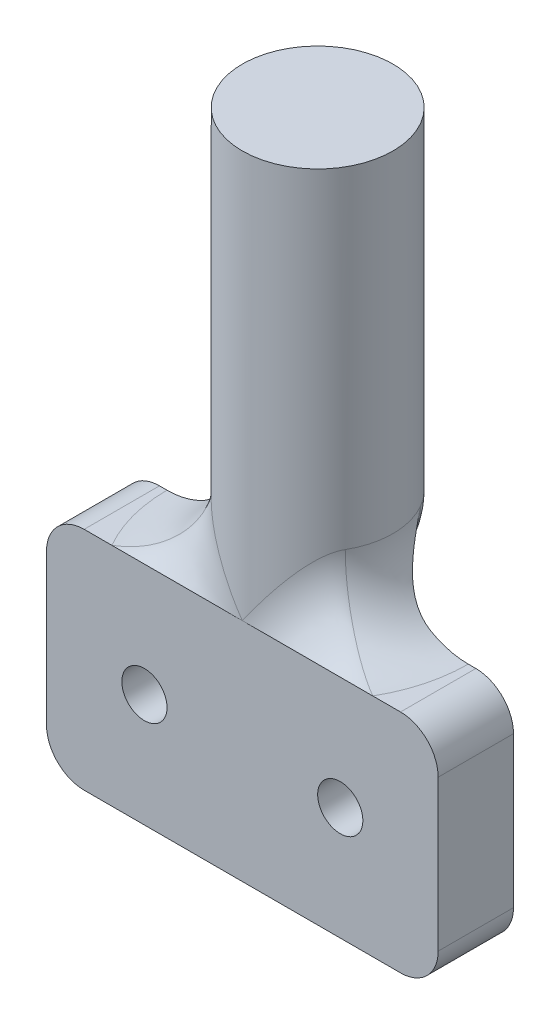
ISO-10303-21;
HEADER;
FILE_DESCRIPTION(('STEP AP214'),'2;1');
FILE_NAME('part.step','',(''),(''),'','','');
FILE_SCHEMA(('AUTOMOTIVE_DESIGN { 1 0 10303 214 1 1 1 1 }'));
ENDSEC;
DATA;
#1=APPLICATION_CONTEXT('core data for automotive mechanical design processes');
#2=APPLICATION_PROTOCOL_DEFINITION('international standard','automotive_design',2000,#1);
#3=PRODUCT_CONTEXT('',#1,'mechanical');
#4=PRODUCT('Part','Part','',(#3));
#5=PRODUCT_RELATED_PRODUCT_CATEGORY('part','',(#4));
#6=PRODUCT_DEFINITION_FORMATION('','',#4);
#7=PRODUCT_DEFINITION_CONTEXT('part definition',#1,'design');
#8=PRODUCT_DEFINITION('design','',#6,#7);
#9=PRODUCT_DEFINITION_SHAPE('','',#8);
#10=(LENGTH_UNIT() NAMED_UNIT(*) SI_UNIT(.MILLI.,.METRE.));
#11=(NAMED_UNIT(*) PLANE_ANGLE_UNIT() SI_UNIT($,.RADIAN.));
#12=(NAMED_UNIT(*) SI_UNIT($,.STERADIAN.) SOLID_ANGLE_UNIT());
#13=UNCERTAINTY_MEASURE_WITH_UNIT(LENGTH_MEASURE(1.E-05),#10,'distance_accuracy_value','');
#14=(GEOMETRIC_REPRESENTATION_CONTEXT(3) GLOBAL_UNCERTAINTY_ASSIGNED_CONTEXT((#13)) GLOBAL_UNIT_ASSIGNED_CONTEXT((#10,
#11,#12)) REPRESENTATION_CONTEXT('',''));
#15=CARTESIAN_POINT('',(0.,0.,0.));
#16=DIRECTION('',(0.,0.,1.));
#17=DIRECTION('',(1.,0.,0.));
#18=AXIS2_PLACEMENT_3D('',#15,#16,#17);
#19=CARTESIAN_POINT('',(0.,15.,5.));
#20=DIRECTION('',(0.,-1.,0.));
#21=DIRECTION('',(0.,0.,-1.));
#22=AXIS2_PLACEMENT_3D('',#19,#20,#21);
#23=PLANE('',#22);
#24=DIRECTION('',(-1.,0.,0.));
#25=VECTOR('',#24,1.);
#26=CARTESIAN_POINT('',(0.,15.,5.));
#27=LINE('',#26,#25);
#28=CARTESIAN_POINT('',(4.33974596215561,15.,5.));
#29=VERTEX_POINT('',#28);
#30=CARTESIAN_POINT('',(2.5,15.,5.));
#31=VERTEX_POINT('',#30);
#32=EDGE_CURVE('E351',#29,#31,#27,.T.);
#33=ORIENTED_EDGE('',*,*,#32,.F.);
#34=CARTESIAN_POINT('',(13.,15.,0.));
#35=DIRECTION('',(0.,-1.,0.));
#36=DIRECTION('',(0.,0.,-1.));
#37=AXIS2_PLACEMENT_3D('',#34,#35,#36);
#38=CIRCLE('',#37,10.);
#39=CARTESIAN_POINT('',(3.,15.,0.));
#40=VERTEX_POINT('',#39);
#41=EDGE_CURVE('E337',#29,#40,#38,.T.);
#42=ORIENTED_EDGE('',*,*,#41,.T.);
#43=DIRECTION('',(-1.,0.,0.));
#44=VECTOR('',#43,1.);
#45=CARTESIAN_POINT('',(0.,15.,0.));
#46=LINE('',#45,#44);
#47=CARTESIAN_POINT('',(2.5,15.,0.));
#48=VERTEX_POINT('',#47);
#49=EDGE_CURVE('E168',#40,#48,#46,.T.);
#50=ORIENTED_EDGE('',*,*,#49,.T.);
#51=DIRECTION('',(0.,0.,-1.));
#52=VECTOR('',#51,1.);
#53=CARTESIAN_POINT('',(2.5,15.,5.));
#54=LINE('',#53,#52);
#55=EDGE_CURVE('E160',#48,#31,#54,.F.);
#56=ORIENTED_EDGE('',*,*,#55,.T.);
#57=EDGE_LOOP('',(#33,#42,#50,#56));
#58=FACE_BOUND('',#57,.T.);
#59=ADVANCED_FACE('F36',(#58),#23,.F.);
#60=CARTESIAN_POINT('',(0.,0.,5.));
#61=DIRECTION('',(0.,0.,-1.));
#62=DIRECTION('',(-1.,0.,0.));
#63=AXIS2_PLACEMENT_3D('',#60,#61,#62);
#64=PLANE('',#63);
#65=DIRECTION('',(0.,1.,0.));
#66=VECTOR('',#65,1.);
#67=CARTESIAN_POINT('',(26.,0.,5.));
#68=LINE('',#67,#66);
#69=CARTESIAN_POINT('',(26.,2.5,5.));
#70=VERTEX_POINT('',#69);
#71=CARTESIAN_POINT('',(26.,12.5,5.));
#72=VERTEX_POINT('',#71);
#73=EDGE_CURVE('E357',#70,#72,#68,.T.);
#74=ORIENTED_EDGE('',*,*,#73,.T.);
#75=CARTESIAN_POINT('',(23.5,12.5,5.));
#76=DIRECTION('',(0.,0.,-1.));
#77=DIRECTION('',(-1.,0.,0.));
#78=AXIS2_PLACEMENT_3D('',#75,#76,#77);
#79=CIRCLE('',#78,2.5);
#80=CARTESIAN_POINT('',(23.5,15.,5.));
#81=VERTEX_POINT('',#80);
#82=EDGE_CURVE('E193',#72,#81,#79,.F.);
#83=ORIENTED_EDGE('',*,*,#82,.T.);
#84=CARTESIAN_POINT('',(21.6602540378444,15.,5.));
#85=VERTEX_POINT('',#84);
#86=EDGE_CURVE('E158',#81,#85,#27,.T.);
#87=ORIENTED_EDGE('',*,*,#86,.T.);
#88=CARTESIAN_POINT('',(13.,15.,5.));
#89=VERTEX_POINT('',#88);
#90=EDGE_CURVE('E350',#85,#89,#27,.T.);
#91=ORIENTED_EDGE('',*,*,#90,.T.);
#92=EDGE_CURVE('E347',#89,#29,#27,.T.);
#93=ORIENTED_EDGE('',*,*,#92,.T.);
#94=ORIENTED_EDGE('',*,*,#32,.T.);
#95=CARTESIAN_POINT('',(2.5,12.5,5.));
#96=DIRECTION('',(0.,0.,-1.));
#97=DIRECTION('',(-1.,0.,0.));
#98=AXIS2_PLACEMENT_3D('',#95,#96,#97);
#99=CIRCLE('',#98,2.5);
#100=CARTESIAN_POINT('',(0.,12.5,5.));
#101=VERTEX_POINT('',#100);
#102=EDGE_CURVE('E187',#31,#101,#99,.F.);
#103=ORIENTED_EDGE('',*,*,#102,.T.);
#104=DIRECTION('',(0.,-1.,0.));
#105=VECTOR('',#104,1.);
#106=CARTESIAN_POINT('',(0.,0.,5.));
#107=LINE('',#106,#105);
#108=CARTESIAN_POINT('',(0.,2.5,5.));
#109=VERTEX_POINT('',#108);
#110=EDGE_CURVE('E167',#101,#109,#107,.T.);
#111=ORIENTED_EDGE('',*,*,#110,.T.);
#112=CARTESIAN_POINT('',(2.5,2.5,5.));
#113=DIRECTION('',(0.,0.,-1.));
#114=DIRECTION('',(-1.,0.,0.));
#115=AXIS2_PLACEMENT_3D('',#112,#113,#114);
#116=CIRCLE('',#115,2.5);
#117=CARTESIAN_POINT('',(2.5,0.,5.));
#118=VERTEX_POINT('',#117);
#119=EDGE_CURVE('E189',#109,#118,#116,.F.);
#120=ORIENTED_EDGE('',*,*,#119,.T.);
#121=DIRECTION('',(1.,0.,0.));
#122=VECTOR('',#121,1.);
#123=CARTESIAN_POINT('',(0.,0.,5.));
#124=LINE('',#123,#122);
#125=CARTESIAN_POINT('',(23.5,0.,5.));
#126=VERTEX_POINT('',#125);
#127=EDGE_CURVE('E171',#118,#126,#124,.T.);
#128=ORIENTED_EDGE('',*,*,#127,.T.);
#129=CARTESIAN_POINT('',(23.5,2.5,5.));
#130=DIRECTION('',(0.,0.,-1.));
#131=DIRECTION('',(-1.,0.,0.));
#132=AXIS2_PLACEMENT_3D('',#129,#130,#131);
#133=CIRCLE('',#132,2.5);
#134=EDGE_CURVE('E191',#126,#70,#133,.F.);
#135=ORIENTED_EDGE('',*,*,#134,.T.);
#136=EDGE_LOOP('',(#74,#83,#87,#91,#93,#94,#103,#111,#120,#128,#135));
#137=FACE_BOUND('',#136,.T.);
#138=CARTESIAN_POINT('',(6.5,7.5,5.));
#139=DIRECTION('',(0.,0.,1.));
#140=DIRECTION('',(1.,0.,0.));
#141=AXIS2_PLACEMENT_3D('',#138,#139,#140);
#142=CIRCLE('',#141,1.5);
#143=CARTESIAN_POINT('',(8.,7.5,5.));
#144=VERTEX_POINT('',#143);
#145=EDGE_CURVE('E362',#144,#144,#142,.T.);
#146=ORIENTED_EDGE('',*,*,#145,.F.);
#147=EDGE_LOOP('',(#146));
#148=FACE_BOUND('',#147,.T.);
#149=CARTESIAN_POINT('',(19.5,7.5,5.));
#150=DIRECTION('',(0.,0.,1.));
#151=DIRECTION('',(1.,0.,0.));
#152=AXIS2_PLACEMENT_3D('',#149,#150,#151);
#153=CIRCLE('',#152,1.5);
#154=CARTESIAN_POINT('',(21.,7.5,5.));
#155=VERTEX_POINT('',#154);
#156=EDGE_CURVE('E383',#155,#155,#153,.T.);
#157=ORIENTED_EDGE('',*,*,#156,.F.);
#158=EDGE_LOOP('',(#157));
#159=FACE_BOUND('',#158,.T.);
#160=ADVANCED_FACE('F305',(#137,#148,#159),#64,.F.);
#161=CARTESIAN_POINT('',(0.,0.,0.));
#162=DIRECTION('',(0.,0.,-1.));
#163=DIRECTION('',(-1.,0.,0.));
#164=AXIS2_PLACEMENT_3D('',#161,#162,#163);
#165=PLANE('',#164);
#166=CARTESIAN_POINT('',(6.5,7.5,0.));
#167=DIRECTION('',(0.,0.,1.));
#168=DIRECTION('',(1.,0.,0.));
#169=AXIS2_PLACEMENT_3D('',#166,#167,#168);
#170=CIRCLE('',#169,1.5);
#171=CARTESIAN_POINT('',(8.,7.5,0.));
#172=VERTEX_POINT('',#171);
#173=EDGE_CURVE('E380',#172,#172,#170,.T.);
#174=ORIENTED_EDGE('',*,*,#173,.T.);
#175=EDGE_LOOP('',(#174));
#176=FACE_BOUND('',#175,.T.);
#177=CARTESIAN_POINT('',(13.,20.,0.));
#178=DIRECTION('',(0.,0.,-1.));
#179=DIRECTION('',(-1.,0.,0.));
#180=AXIS2_PLACEMENT_3D('',#177,#178,#179);
#181=CIRCLE('',#180,8.66025403784439);
#182=CARTESIAN_POINT('',(5.5,15.6698729810778,0.));
#183=VERTEX_POINT('',#182);
#184=CARTESIAN_POINT('',(13.,11.3397459621556,0.));
#185=VERTEX_POINT('',#184);
#186=EDGE_CURVE('E273',#183,#185,#181,.F.);
#187=ORIENTED_EDGE('',*,*,#186,.T.);
#188=CARTESIAN_POINT('',(13.,20.,0.));
#189=DIRECTION('',(0.,0.,-1.));
#190=DIRECTION('',(-1.,0.,0.));
#191=AXIS2_PLACEMENT_3D('',#188,#189,#190);
#192=CIRCLE('',#191,8.66025403784439);
#193=CARTESIAN_POINT('',(20.5,15.6698729810778,0.));
#194=VERTEX_POINT('',#193);
#195=EDGE_CURVE('E323',#185,#194,#192,.F.);
#196=ORIENTED_EDGE('',*,*,#195,.T.);
#197=CARTESIAN_POINT('',(23.,20.,0.));
#198=DIRECTION('',(0.,0.,-1.));
#199=DIRECTION('',(-1.,0.,0.));
#200=AXIS2_PLACEMENT_3D('',#197,#198,#199);
#201=CIRCLE('',#200,5.);
#202=CARTESIAN_POINT('',(23.,15.,0.));
#203=VERTEX_POINT('',#202);
#204=EDGE_CURVE('E166',#194,#203,#201,.F.);
#205=ORIENTED_EDGE('',*,*,#204,.T.);
#206=CARTESIAN_POINT('',(23.5,15.,0.));
#207=VERTEX_POINT('',#206);
#208=EDGE_CURVE('E155',#207,#203,#46,.T.);
#209=ORIENTED_EDGE('',*,*,#208,.F.);
#210=CARTESIAN_POINT('',(23.5,12.5,0.));
#211=DIRECTION('',(0.,0.,-1.));
#212=DIRECTION('',(-1.,0.,0.));
#213=AXIS2_PLACEMENT_3D('',#210,#211,#212);
#214=CIRCLE('',#213,2.5);
#215=CARTESIAN_POINT('',(26.,12.5,0.));
#216=VERTEX_POINT('',#215);
#217=EDGE_CURVE('E138',#207,#216,#214,.T.);
#218=ORIENTED_EDGE('',*,*,#217,.T.);
#219=DIRECTION('',(0.,1.,0.));
#220=VECTOR('',#219,1.);
#221=CARTESIAN_POINT('',(26.,0.,0.));
#222=LINE('',#221,#220);
#223=CARTESIAN_POINT('',(26.,2.5,0.));
#224=VERTEX_POINT('',#223);
#225=EDGE_CURVE('E173',#224,#216,#222,.T.);
#226=ORIENTED_EDGE('',*,*,#225,.F.);
#227=CARTESIAN_POINT('',(23.5,2.5,0.));
#228=DIRECTION('',(0.,0.,-1.));
#229=DIRECTION('',(-1.,0.,0.));
#230=AXIS2_PLACEMENT_3D('',#227,#228,#229);
#231=CIRCLE('',#230,2.5);
#232=CARTESIAN_POINT('',(23.5,0.,0.));
#233=VERTEX_POINT('',#232);
#234=EDGE_CURVE('E149',#224,#233,#231,.T.);
#235=ORIENTED_EDGE('',*,*,#234,.T.);
#236=DIRECTION('',(1.,0.,0.));
#237=VECTOR('',#236,1.);
#238=CARTESIAN_POINT('',(0.,0.,0.));
#239=LINE('',#238,#237);
#240=CARTESIAN_POINT('',(2.5,0.,0.));
#241=VERTEX_POINT('',#240);
#242=EDGE_CURVE('E361',#241,#233,#239,.T.);
#243=ORIENTED_EDGE('',*,*,#242,.F.);
#244=CARTESIAN_POINT('',(2.5,2.5,0.));
#245=DIRECTION('',(0.,0.,-1.));
#246=DIRECTION('',(-1.,0.,0.));
#247=AXIS2_PLACEMENT_3D('',#244,#245,#246);
#248=CIRCLE('',#247,2.5);
#249=CARTESIAN_POINT('',(0.,2.5,0.));
#250=VERTEX_POINT('',#249);
#251=EDGE_CURVE('E181',#241,#250,#248,.T.);
#252=ORIENTED_EDGE('',*,*,#251,.T.);
#253=DIRECTION('',(0.,-1.,0.));
#254=VECTOR('',#253,1.);
#255=CARTESIAN_POINT('',(0.,0.,0.));
#256=LINE('',#255,#254);
#257=CARTESIAN_POINT('',(0.,12.5,0.));
#258=VERTEX_POINT('',#257);
#259=EDGE_CURVE('E359',#258,#250,#256,.T.);
#260=ORIENTED_EDGE('',*,*,#259,.F.);
#261=CARTESIAN_POINT('',(2.5,12.5,0.));
#262=DIRECTION('',(0.,0.,-1.));
#263=DIRECTION('',(-1.,0.,0.));
#264=AXIS2_PLACEMENT_3D('',#261,#262,#263);
#265=CIRCLE('',#264,2.5);
#266=EDGE_CURVE('E159',#258,#48,#265,.T.);
#267=ORIENTED_EDGE('',*,*,#266,.T.);
#268=ORIENTED_EDGE('',*,*,#49,.F.);
#269=CARTESIAN_POINT('',(3.,20.,0.));
#270=DIRECTION('',(0.,0.,-1.));
#271=DIRECTION('',(-1.,0.,0.));
#272=AXIS2_PLACEMENT_3D('',#269,#270,#271);
#273=CIRCLE('',#272,5.);
#274=EDGE_CURVE('E332',#40,#183,#273,.F.);
#275=ORIENTED_EDGE('',*,*,#274,.T.);
#276=EDGE_LOOP('',(#187,#196,#205,#209,#218,#226,#235,#243,#252,#260,#267,#268,#275));
#277=FACE_BOUND('',#276,.T.);
#278=CARTESIAN_POINT('',(19.5,7.5,0.));
#279=DIRECTION('',(0.,0.,1.));
#280=DIRECTION('',(1.,0.,0.));
#281=AXIS2_PLACEMENT_3D('',#278,#279,#280);
#282=CIRCLE('',#281,1.5);
#283=CARTESIAN_POINT('',(21.,7.5,0.));
#284=VERTEX_POINT('',#283);
#285=EDGE_CURVE('E386',#284,#284,#282,.T.);
#286=ORIENTED_EDGE('',*,*,#285,.T.);
#287=EDGE_LOOP('',(#286));
#288=FACE_BOUND('',#287,.T.);
#289=ADVANCED_FACE('F162',(#176,#277,#288),#165,.T.);
#290=CARTESIAN_POINT('',(0.,0.,5.));
#291=DIRECTION('',(1.,0.,0.));
#292=DIRECTION('',(0.,0.,-1.));
#293=AXIS2_PLACEMENT_3D('',#290,#291,#292);
#294=PLANE('',#293);
#295=ORIENTED_EDGE('',*,*,#259,.T.);
#296=DIRECTION('',(0.,0.,-1.));
#297=VECTOR('',#296,1.);
#298=CARTESIAN_POINT('',(0.,2.5,5.));
#299=LINE('',#298,#297);
#300=EDGE_CURVE('E203',#250,#109,#299,.F.);
#301=ORIENTED_EDGE('',*,*,#300,.T.);
#302=ORIENTED_EDGE('',*,*,#110,.F.);
#303=DIRECTION('',(0.,0.,-1.));
#304=VECTOR('',#303,1.);
#305=CARTESIAN_POINT('',(0.,12.5,5.));
#306=LINE('',#305,#304);
#307=EDGE_CURVE('E200',#101,#258,#306,.T.);
#308=ORIENTED_EDGE('',*,*,#307,.T.);
#309=EDGE_LOOP('',(#295,#301,#302,#308));
#310=FACE_BOUND('',#309,.T.);
#311=ADVANCED_FACE('F414',(#310),#294,.F.);
#312=CARTESIAN_POINT('',(0.,0.,5.));
#313=DIRECTION('',(0.,1.,0.));
#314=DIRECTION('',(0.,0.,1.));
#315=AXIS2_PLACEMENT_3D('',#312,#313,#314);
#316=PLANE('',#315);
#317=ORIENTED_EDGE('',*,*,#242,.T.);
#318=DIRECTION('',(0.,0.,-1.));
#319=VECTOR('',#318,1.);
#320=CARTESIAN_POINT('',(23.5,0.,5.));
#321=LINE('',#320,#319);
#322=EDGE_CURVE('E198',#233,#126,#321,.F.);
#323=ORIENTED_EDGE('',*,*,#322,.T.);
#324=ORIENTED_EDGE('',*,*,#127,.F.);
#325=DIRECTION('',(0.,0.,-1.));
#326=VECTOR('',#325,1.);
#327=CARTESIAN_POINT('',(2.5,0.,5.));
#328=LINE('',#327,#326);
#329=EDGE_CURVE('E195',#118,#241,#328,.T.);
#330=ORIENTED_EDGE('',*,*,#329,.T.);
#331=EDGE_LOOP('',(#317,#323,#324,#330));
#332=FACE_BOUND('',#331,.T.);
#333=ADVANCED_FACE('F376',(#332),#316,.F.);
#334=CARTESIAN_POINT('',(26.,0.,5.));
#335=DIRECTION('',(-1.,0.,0.));
#336=DIRECTION('',(0.,0.,1.));
#337=AXIS2_PLACEMENT_3D('',#334,#335,#336);
#338=PLANE('',#337);
#339=ORIENTED_EDGE('',*,*,#225,.T.);
#340=DIRECTION('',(0.,0.,-1.));
#341=VECTOR('',#340,1.);
#342=CARTESIAN_POINT('',(26.,12.5,5.));
#343=LINE('',#342,#341);
#344=EDGE_CURVE('E143',#216,#72,#343,.F.);
#345=ORIENTED_EDGE('',*,*,#344,.T.);
#346=ORIENTED_EDGE('',*,*,#73,.F.);
#347=DIRECTION('',(0.,0.,-1.));
#348=VECTOR('',#347,1.);
#349=CARTESIAN_POINT('',(26.,2.5,5.));
#350=LINE('',#349,#348);
#351=EDGE_CURVE('E148',#70,#224,#350,.T.);
#352=ORIENTED_EDGE('',*,*,#351,.T.);
#353=EDGE_LOOP('',(#339,#345,#346,#352));
#354=FACE_BOUND('',#353,.T.);
#355=ADVANCED_FACE('F368',(#354),#338,.F.);
#356=ORIENTED_EDGE('',*,*,#208,.T.);
#357=CARTESIAN_POINT('',(13.,15.,0.));
#358=DIRECTION('',(0.,-1.,0.));
#359=DIRECTION('',(0.,0.,-1.));
#360=AXIS2_PLACEMENT_3D('',#357,#358,#359);
#361=CIRCLE('',#360,10.);
#362=EDGE_CURVE('E333',#203,#85,#361,.T.);
#363=ORIENTED_EDGE('',*,*,#362,.T.);
#364=ORIENTED_EDGE('',*,*,#86,.F.);
#365=DIRECTION('',(0.,0.,-1.));
#366=VECTOR('',#365,1.);
#367=CARTESIAN_POINT('',(23.5,15.,5.));
#368=LINE('',#367,#366);
#369=EDGE_CURVE('E142',#81,#207,#368,.T.);
#370=ORIENTED_EDGE('',*,*,#369,.T.);
#371=EDGE_LOOP('',(#356,#363,#364,#370));
#372=FACE_BOUND('',#371,.T.);
#373=ADVANCED_FACE('F154',(#372),#23,.F.);
#374=CARTESIAN_POINT('',(6.5,7.5,5.));
#375=DIRECTION('',(0.,0.,-1.));
#376=DIRECTION('',(-1.,0.,0.));
#377=AXIS2_PLACEMENT_3D('',#374,#375,#376);
#378=CYLINDRICAL_SURFACE('',#377,1.5);
#379=ORIENTED_EDGE('',*,*,#145,.T.);
#380=EDGE_LOOP('',(#379));
#381=FACE_BOUND('',#380,.T.);
#382=ORIENTED_EDGE('',*,*,#173,.F.);
#383=EDGE_LOOP('',(#382));
#384=FACE_BOUND('',#383,.T.);
#385=ADVANCED_FACE('F405',(#381,#384),#378,.F.);
#386=CARTESIAN_POINT('',(19.5,7.5,5.));
#387=DIRECTION('',(0.,0.,-1.));
#388=DIRECTION('',(-1.,0.,0.));
#389=AXIS2_PLACEMENT_3D('',#386,#387,#388);
#390=CYLINDRICAL_SURFACE('',#389,1.5);
#391=ORIENTED_EDGE('',*,*,#156,.T.);
#392=EDGE_LOOP('',(#391));
#393=FACE_BOUND('',#392,.T.);
#394=ORIENTED_EDGE('',*,*,#285,.F.);
#395=EDGE_LOOP('',(#394));
#396=FACE_BOUND('',#395,.T.);
#397=ADVANCED_FACE('F234',(#393,#396),#390,.F.);
#398=CARTESIAN_POINT('',(23.5,12.5,5.));
#399=DIRECTION('',(0.,0.,-1.));
#400=DIRECTION('',(-1.,0.,0.));
#401=AXIS2_PLACEMENT_3D('',#398,#399,#400);
#402=CYLINDRICAL_SURFACE('',#401,2.5);
#403=ORIENTED_EDGE('',*,*,#82,.F.);
#404=ORIENTED_EDGE('',*,*,#344,.F.);
#405=ORIENTED_EDGE('',*,*,#217,.F.);
#406=ORIENTED_EDGE('',*,*,#369,.F.);
#407=EDGE_LOOP('',(#403,#404,#405,#406));
#408=FACE_BOUND('',#407,.T.);
#409=ADVANCED_FACE('F141',(#408),#402,.T.);
#410=CARTESIAN_POINT('',(23.5,2.5,5.));
#411=DIRECTION('',(0.,0.,-1.));
#412=DIRECTION('',(-1.,0.,0.));
#413=AXIS2_PLACEMENT_3D('',#410,#411,#412);
#414=CYLINDRICAL_SURFACE('',#413,2.5);
#415=ORIENTED_EDGE('',*,*,#134,.F.);
#416=ORIENTED_EDGE('',*,*,#322,.F.);
#417=ORIENTED_EDGE('',*,*,#234,.F.);
#418=ORIENTED_EDGE('',*,*,#351,.F.);
#419=EDGE_LOOP('',(#415,#416,#417,#418));
#420=FACE_BOUND('',#419,.T.);
#421=ADVANCED_FACE('F373',(#420),#414,.T.);
#422=CARTESIAN_POINT('',(2.5,2.5,5.));
#423=DIRECTION('',(0.,0.,-1.));
#424=DIRECTION('',(-1.,0.,0.));
#425=AXIS2_PLACEMENT_3D('',#422,#423,#424);
#426=CYLINDRICAL_SURFACE('',#425,2.5);
#427=ORIENTED_EDGE('',*,*,#119,.F.);
#428=ORIENTED_EDGE('',*,*,#300,.F.);
#429=ORIENTED_EDGE('',*,*,#251,.F.);
#430=ORIENTED_EDGE('',*,*,#329,.F.);
#431=EDGE_LOOP('',(#427,#428,#429,#430));
#432=FACE_BOUND('',#431,.T.);
#433=ADVANCED_FACE('F424',(#432),#426,.T.);
#434=CARTESIAN_POINT('',(2.5,12.5,5.));
#435=DIRECTION('',(0.,0.,-1.));
#436=DIRECTION('',(-1.,0.,0.));
#437=AXIS2_PLACEMENT_3D('',#434,#435,#436);
#438=CYLINDRICAL_SURFACE('',#437,2.5);
#439=ORIENTED_EDGE('',*,*,#102,.F.);
#440=ORIENTED_EDGE('',*,*,#55,.F.);
#441=ORIENTED_EDGE('',*,*,#266,.F.);
#442=ORIENTED_EDGE('',*,*,#307,.F.);
#443=EDGE_LOOP('',(#439,#440,#441,#442));
#444=FACE_BOUND('',#443,.T.);
#445=ADVANCED_FACE('F232',(#444),#438,.T.);
#446=CARTESIAN_POINT('',(13.,42.,0.));
#447=DIRECTION('',(0.,-1.,0.));
#448=DIRECTION('',(0.,0.,-1.));
#449=AXIS2_PLACEMENT_3D('',#446,#447,#448);
#450=CYLINDRICAL_SURFACE('',#449,5.);
#451=CARTESIAN_POINT('',(13.,42.,0.));
#452=DIRECTION('',(0.,1.,0.));
#453=DIRECTION('',(0.,0.,1.));
#454=AXIS2_PLACEMENT_3D('',#451,#452,#453);
#455=CIRCLE('',#454,5.);
#456=CARTESIAN_POINT('',(13.,42.,5.));
#457=VERTEX_POINT('',#456);
#458=EDGE_CURVE('E317',#457,#457,#455,.T.);
#459=ORIENTED_EDGE('',*,*,#458,.F.);
#460=EDGE_LOOP('',(#459));
#461=FACE_BOUND('',#460,.T.);
#462=CARTESIAN_POINT('',(13.,20.,0.));
#463=DIRECTION('',(0.,-1.,0.));
#464=DIRECTION('',(0.,0.,-1.));
#465=AXIS2_PLACEMENT_3D('',#462,#463,#464);
#466=CIRCLE('',#465,5.);
#467=CARTESIAN_POINT('',(17.3301270189222,20.,2.5));
#468=VERTEX_POINT('',#467);
#469=CARTESIAN_POINT('',(17.3301270189222,20.,-2.5));
#470=VERTEX_POINT('',#469);
#471=EDGE_CURVE('E54',#468,#470,#466,.F.);
#472=ORIENTED_EDGE('',*,*,#471,.T.);
#473=CARTESIAN_POINT('',(13.,20.,0.));
#474=DIRECTION('',(0.,-1.,0.));
#475=DIRECTION('',(0.,0.,-1.));
#476=AXIS2_PLACEMENT_3D('',#473,#474,#475);
#477=CIRCLE('',#476,5.);
#478=CARTESIAN_POINT('',(8.66987298107781,20.,-2.5));
#479=VERTEX_POINT('',#478);
#480=EDGE_CURVE('E205',#470,#479,#477,.F.);
#481=ORIENTED_EDGE('',*,*,#480,.T.);
#482=CARTESIAN_POINT('',(13.,20.,0.));
#483=DIRECTION('',(0.,-1.,0.));
#484=DIRECTION('',(0.,0.,-1.));
#485=AXIS2_PLACEMENT_3D('',#482,#483,#484);
#486=CIRCLE('',#485,5.);
#487=CARTESIAN_POINT('',(8.66987298107781,20.,2.5));
#488=VERTEX_POINT('',#487);
#489=EDGE_CURVE('E338',#479,#488,#486,.F.);
#490=ORIENTED_EDGE('',*,*,#489,.T.);
#491=CARTESIAN_POINT('',(8.44195994437424,19.9202620544522,2.05530310448633));
#492=CARTESIAN_POINT('',(8.80153048112986,14.6118548221809,2.85272169728535));
#493=CARTESIAN_POINT('',(3.88391988874849,15.,5.));
#494=CARTESIAN_POINT('',(8.48043303750433,19.9511499452849,2.14068643796849));
#495=CARTESIAN_POINT('',(8.77880872442267,14.6718256752968,2.76216809026848));
#496=CARTESIAN_POINT('',(3.96086607500863,15.,5.));
#497=CARTESIAN_POINT('',(8.52162183339983,19.9726365315721,2.22556331343184));
#498=CARTESIAN_POINT('',(8.7529998938867,14.7417614429014,2.68417100553671));
#499=CARTESIAN_POINT('',(4.04324366679963,15.,5.));
#500=CARTESIAN_POINT('',(8.60890414071584,19.9982438378198,2.39314114433354));
#501=CARTESIAN_POINT('',(8.70170792625993,14.8931099834088,2.55728084793841));
#502=CARTESIAN_POINT('',(4.21780828143168,15.,5.));
#503=CARTESIAN_POINT('',(8.65498370900732,20.0024126342168,2.47584748944671));
#504=CARTESIAN_POINT('',(8.67629237932178,14.9741094331225,2.50806837066561));
#505=CARTESIAN_POINT('',(4.30996741801466,15.,5.));
#506=CARTESIAN_POINT('',(8.79392337998744,19.9917340834465,2.70927948247871));
#507=CARTESIAN_POINT('',(8.61249452582053,15.2105816882442,2.41098053181199));
#508=CARTESIAN_POINT('',(4.58784675997486,15.,5.));
#509=CARTESIAN_POINT('',(8.89253874511008,19.9571354014968,2.85643120324117));
#510=CARTESIAN_POINT('',(8.58097592420278,15.3714632454671,2.39816147342421));
#511=CARTESIAN_POINT('',(4.78507749022,15.,5.));
#512=CARTESIAN_POINT('',(9.1025299437112,19.843501035599,3.13698820397232));
#513=CARTESIAN_POINT('',(8.56262127421029,15.6662457386049,2.45656307356089));
#514=CARTESIAN_POINT('',(5.20505988742256,15.,5.));
#515=CARTESIAN_POINT('',(9.21394954582881,19.7643090922455,3.27034318293193));
#516=CARTESIAN_POINT('',(8.57444618560457,15.8005731903149,2.52514010962124));
#517=CARTESIAN_POINT('',(5.42789909165821,15.,5.));
#518=CARTESIAN_POINT('',(9.48949601569641,19.5357179711413,3.56809882852757));
#519=CARTESIAN_POINT('',(8.66091472554572,16.0627013413032,2.74390337689512));
#520=CARTESIAN_POINT('',(5.97899203139202,15.,5.));
#521=CARTESIAN_POINT('',(9.65784067885019,19.3711717024033,3.72566075851406));
#522=CARTESIAN_POINT('',(8.75433851722235,16.1753242495986,2.91329500352805));
#523=CARTESIAN_POINT('',(6.31568135769681,15.,5.));
#524=CARTESIAN_POINT('',(10.0066191146274,18.9975594925775,4.01132385557012));
#525=CARTESIAN_POINT('',(9.01961965121259,16.3116427640292,3.27263817313337));
#526=CARTESIAN_POINT('',(7.01323822925846,15.,5.));
#527=CARTESIAN_POINT('',(10.1870719346716,18.7884222239224,4.13937712965506));
#528=CARTESIAN_POINT('',(9.18904006576446,16.3391137763048,3.46262219561566));
#529=CARTESIAN_POINT('',(7.37414386935663,15.,5.));
#530=CARTESIAN_POINT('',(10.5017991497945,18.4056738244635,4.33387258417418));
#531=CARTESIAN_POINT('',(9.52669490284049,16.3268146293075,3.77243011188368));
#532=CARTESIAN_POINT('',(8.00359829957934,15.,5.));
#533=CARTESIAN_POINT('',(10.6341136485614,18.2396055408561,4.40737391196365));
#534=CARTESIAN_POINT('',(9.67927024031462,16.3054151043712,3.89615950634731));
#535=CARTESIAN_POINT('',(8.26822729709203,15.,5.));
#536=CARTESIAN_POINT('',(10.901813571514,17.8958440278793,4.54092504491246));
#537=CARTESIAN_POINT('',(10.0050491525105,16.2356318598458,4.12772386940433));
#538=CARTESIAN_POINT('',(8.80362714299848,15.,5.));
#539=CARTESIAN_POINT('',(11.0372003872744,17.7181454591506,4.60096861497079));
#540=CARTESIAN_POINT('',(10.1784071796365,16.1876518475126,4.23626010253703));
#541=CARTESIAN_POINT('',(9.07440077454165,15.,5.));
#542=CARTESIAN_POINT('',(11.3101788353066,17.3541760796535,4.708078675522));
#543=CARTESIAN_POINT('',(10.5401101214765,16.0711934166957,4.43321995617232));
#544=CARTESIAN_POINT('',(9.62035767062034,15.,5.));
#545=CARTESIAN_POINT('',(11.4477705925739,17.1679047817791,4.75514442754501));
#546=CARTESIAN_POINT('',(10.7288520401001,16.0028361899608,4.52230897361374));
#547=CARTESIAN_POINT('',(9.89554118514674,15.,5.));
#548=CARTESIAN_POINT('',(11.7244752854001,16.789270049503,4.83671705131449));
#549=CARTESIAN_POINT('',(11.1166669186331,15.8513860191714,4.67816780468817));
#550=CARTESIAN_POINT('',(10.4489505707956,15.,5.));
#551=CARTESIAN_POINT('',(11.863587679013,16.5969087419948,4.87122825618364));
#552=CARTESIAN_POINT('',(11.3162974391486,15.7682091165779,4.74549262457121));
#553=CARTESIAN_POINT('',(10.7271753580261,15.,5.));
#554=CARTESIAN_POINT('',(12.1671671716195,16.1742290005612,4.93298978907587));
#555=CARTESIAN_POINT('',(11.7571546820079,15.5769093036488,4.86632253464833));
#556=CARTESIAN_POINT('',(11.334334343239,15.,5.));
#557=CARTESIAN_POINT('',(12.3318327667238,15.9431317877623,4.95793064684535));
#558=CARTESIAN_POINT('',(12.00095753234,15.46644964044,4.91607605297541));
#559=CARTESIAN_POINT('',(11.6636655334407,15.,5.));
#560=CARTESIAN_POINT('',(12.6616342693268,15.4785078022004,4.99128497508588));
#561=CARTESIAN_POINT('',(12.4918638846655,15.2395006407501,4.98244888482995));
#562=CARTESIAN_POINT('',(12.3232685386468,15.,5.));
#563=CARTESIAN_POINT('',(12.8267690605856,15.2449853236506,4.99972386277895));
#564=CARTESIAN_POINT('',(12.7401440788685,15.1224966562075,4.99944608365095));
#565=CARTESIAN_POINT('',(12.6535381211711,15.,5.));
#566=CARTESIAN_POINT('',(12.9945567082079,15.0076979767969,4.99999777646746));
#567=CARTESIAN_POINT('',(12.9918350595878,15.0038489899303,4.99999557964991));
#568=CARTESIAN_POINT('',(12.9891134164158,15.,5.));
#569=CARTESIAN_POINT('',(12.9972783644226,15.0038489736552,4.99999999860799));
#570=CARTESIAN_POINT('',(12.9959175466339,15.0019244870827,5.00000002483901));
#571=CARTESIAN_POINT('',(12.9945567288452,15.,5.));
#572=CARTESIAN_POINT('',(13.,15.,5.));
#573=CARTESIAN_POINT('',(13.,15.,5.));
#574=CARTESIAN_POINT('',(13.,15.,5.));
#575=(BOUNDED_SURFACE() B_SPLINE_SURFACE(3,2,((#491,#492,#493),(#494,#495,#496),(#497,#498,
#499),(#500,#501,#502),(#503,#504,#505),(#506,#507,#508),(#509,#510,#511),(#512,#513,#514),
(#515,#516,#517),(#518,#519,#520),(#521,#522,#523),(#524,#525,#526),(#527,#528,#529),(#530,#531,
#532),(#533,#534,#535),(#536,#537,#538),(#539,#540,#541),(#542,#543,#544),(#545,#546,#547),
(#548,#549,#550),(#551,#552,#553),(#554,#555,#556),(#557,#558,#559),(#560,#561,#562),(#563,#564,
#565),(#566,#567,#568),(#569,#570,#571),(#572,#573,#574)),.UNSPECIFIED.,.F.,.F.,
.F.) B_SPLINE_SURFACE_WITH_KNOTS((4,2,2,2,2,2,2,2,2,2,2,2,2,4),(3,3),(0.,0.568793207569174,
1.1360063116335,2.19781568087333,3.26336910264896,4.72426754404271,6.18752060289797,
7.22207784030412,8.25711341116543,9.29220786595557,10.3269447247147,11.5417911059918,
12.7547648370551,12.7747648414995),(0.,1.),
.UNSPECIFIED.) GEOMETRIC_REPRESENTATION_ITEM() RATIONAL_B_SPLINE_SURFACE(((1.,0.680764660953999,
1.),(1.,0.684796528768826,1.),(1.,0.689427813457756,1.),(1.,0.699656894280331,1.),(1.,
0.705251969711266,1.),(1.,0.722410830656439,1.),(1.,0.73492501611774,1.),(1.,0.761122822435041,
1.),(1.,0.774810411250185,1.),(1.,0.807219709513824,1.),(1.,0.825924985565306,1.),(1.,
0.861392507492273,1.),(1.,0.87815157307772,1.),(1.,0.904307667495827,1.),(1.,0.914423086783384,
1.),(1.,0.93306774592078,1.),(1.,0.941596250229083,1.),(1.,0.956962413656766,1.),(1.,
0.963799976555127,1.),(1.,0.975730886647993,1.),(1.,0.980824835603915,1.),(1.,0.989977933965968,
1.),(1.,0.993702626632032,1.),(1.,0.998691042968104,1.),(1.,0.999958551299578,1.),(1.,
0.999999666934123,1.),(1.,1.00000000027104,1.),(1.,1.,1.))) REPRESENTATION_ITEM('') SURFACE());
#576=CARTESIAN_POINT('',(8.44195994437424,19.9202620544522,2.05530310448633));
#577=CARTESIAN_POINT('',(8.48043303750433,19.9511499452849,2.14068643796849));
#578=CARTESIAN_POINT('',(8.52162183339983,19.9726365315721,2.22556331343184));
#579=CARTESIAN_POINT('',(8.60890414071584,19.9982438378198,2.39314114433354));
#580=CARTESIAN_POINT('',(8.65498370900732,20.0024126342168,2.47584748944671));
#581=CARTESIAN_POINT('',(8.79392337998744,19.9917340834465,2.70927948247871));
#582=CARTESIAN_POINT('',(8.89253874511008,19.9571354014968,2.85643120324117));
#583=CARTESIAN_POINT('',(9.1025299437112,19.843501035599,3.13698820397232));
#584=CARTESIAN_POINT('',(9.21394954582881,19.7643090922455,3.27034318293193));
#585=CARTESIAN_POINT('',(9.48949601569641,19.5357179711413,3.56809882852757));
#586=CARTESIAN_POINT('',(9.65784067885019,19.3711717024033,3.72566075851406));
#587=CARTESIAN_POINT('',(10.0066191146275,18.9975594925775,4.01132385557012));
#588=CARTESIAN_POINT('',(10.1870719346716,18.7884222239224,4.13937712965506));
#589=CARTESIAN_POINT('',(10.5017991497945,18.4056738244635,4.33387258417418));
#590=CARTESIAN_POINT('',(10.6341136485614,18.2396055408561,4.40737391196365));
#591=CARTESIAN_POINT('',(10.901813571514,17.8958440278793,4.54092504491246));
#592=CARTESIAN_POINT('',(11.0372003872744,17.7181454591506,4.60096861497079));
#593=CARTESIAN_POINT('',(11.3101788353066,17.3541760796535,4.708078675522));
#594=CARTESIAN_POINT('',(11.4477705925739,17.1679047817791,4.75514442754501));
#595=CARTESIAN_POINT('',(11.7244752854001,16.789270049503,4.83671705131449));
#596=CARTESIAN_POINT('',(11.863587679013,16.5969087419948,4.87122825618364));
#597=CARTESIAN_POINT('',(12.1671671716195,16.1742290005612,4.93298978907587));
#598=CARTESIAN_POINT('',(12.3318327667237,15.9431317877623,4.95793064684535));
#599=CARTESIAN_POINT('',(12.6616342693268,15.4785078022004,4.99128497508589));
#600=CARTESIAN_POINT('',(12.8267690605856,15.2449853236506,4.99972386277895));
#601=CARTESIAN_POINT('',(12.9945567082079,15.0076979767969,4.99999777646746));
#602=CARTESIAN_POINT('',(12.9972783644226,15.0038489736552,4.99999999860799));
#603=CARTESIAN_POINT('',(13.,15.,5.));
#604=B_SPLINE_CURVE_WITH_KNOTS('',3,(#576,#577,#578,#579,#580,#581,#582,#583,#584,#585,#586,
#587,#588,#589,#590,#591,#592,#593,#594,#595,#596,#597,#598,#599,#600,#601,#602,#603),
.UNSPECIFIED.,.F.,.F.,(4,2,2,2,2,2,2,2,2,2,2,2,2,4),(0.,0.568793207569174,1.1360063116335,
2.19781568087333,3.26336910264896,4.72426754404271,6.18752060289797,7.22207784030412,
8.25711341116543,9.29220786595557,10.3269447247147,11.5417911059918,12.7547648370551,
12.7747648414995),.UNSPECIFIED.);
#605=EDGE_CURVE('E216',#488,#89,#604,.T.);
#606=ORIENTED_EDGE('',*,*,#605,.T.);
#607=CARTESIAN_POINT('',(22.116080111126,15.,5.));
#608=CARTESIAN_POINT('',(17.1984695189075,14.6118548222796,2.8527216971376));
#609=CARTESIAN_POINT('',(17.558040055563,19.9202620545025,2.05530310462548));
#610=CARTESIAN_POINT('',(22.0391323690002,15.,5.));
#611=CARTESIAN_POINT('',(17.2211917361429,14.6718268734982,2.76216623183616));
#612=CARTESIAN_POINT('',(17.5195661845001,19.9511505732414,2.14068816942576));
#613=CARTESIAN_POINT('',(21.9567529979356,15.,5.));
#614=CARTESIAN_POINT('',(17.2470011446667,14.7417642491121,2.6841678467967));
#615=CARTESIAN_POINT('',(17.4783764989678,19.9726374031253,2.22556675250503));
#616=CARTESIAN_POINT('',(21.7821844556471,15.,5.));
#617=CARTESIAN_POINT('',(17.2982941308682,14.8931163063534,2.55727632101809));
#618=CARTESIAN_POINT('',(17.3910922278235,19.9982445228146,2.39314788130317));
#619=CARTESIAN_POINT('',(21.6900231733296,15.,5.));
#620=CARTESIAN_POINT('',(17.3237101168052,14.974117641176,2.50806374902878));
#621=CARTESIAN_POINT('',(17.3450115866648,20.0024128936293,2.47585581727675));
#622=CARTESIAN_POINT('',(21.412140230903,15.,5.));
#623=CARTESIAN_POINT('',(17.3875078900308,15.2105924979503,2.41097837180205));
#624=CARTESIAN_POINT('',(17.2060701154515,19.9917324217774,2.70928961955078));
#625=CARTESIAN_POINT('',(21.21490817732,15.,5.));
#626=CARTESIAN_POINT('',(17.4190257876483,15.3714743702281,2.39816153997289));
#627=CARTESIAN_POINT('',(17.1074540886599,19.9571324579302,2.85644153849876));
#628=CARTESIAN_POINT('',(20.7949231241484,15.,5.));
#629=CARTESIAN_POINT('',(17.4373784036987,15.6662565679163,2.45656731518112));
#630=CARTESIAN_POINT('',(16.8974615620743,19.8434954985186,3.13699878506213));
#631=CARTESIAN_POINT('',(20.5720825868808,15.,5.));
#632=CARTESIAN_POINT('',(17.4255521905211,15.8005834522907,2.52514629424846));
#633=CARTESIAN_POINT('',(16.7860412934407,19.764302242756,3.27035381089963));
#634=CARTESIAN_POINT('',(20.0209862096319,15.,5.));
#635=CARTESIAN_POINT('',(17.3390802039545,16.0627097518396,2.74391351890954));
#636=CARTESIAN_POINT('',(16.5104931048156,19.5357079155034,3.5681095868889));
#637=CARTESIAN_POINT('',(19.6842947557183,15.,5.));
#638=CARTESIAN_POINT('',(17.2456540569922,16.1753311169415,2.91330705254417));
#639=CARTESIAN_POINT('',(16.3421473778574,19.3711597028083,3.72567151735437));
#640=CARTESIAN_POINT('',(18.9867336604636,15.,5.));
#641=CARTESIAN_POINT('',(16.9803680865159,16.311646101963,3.27265285438219));
#642=CARTESIAN_POINT('',(15.9933668302336,18.9975436416901,4.01133438584345));
#643=CARTESIAN_POINT('',(18.6258259241345,15.,5.));
#644=CARTESIAN_POINT('',(16.8109451700851,16.3391151442422,3.46263767348877));
#645=CARTESIAN_POINT('',(15.812912962074,18.7884044653768,4.13938743024888));
#646=CARTESIAN_POINT('',(17.9963680940009,15.,5.));
#647=CARTESIAN_POINT('',(16.4732862390189,16.3268126261027,3.77244607216451));
#648=CARTESIAN_POINT('',(15.4981840469957,18.4056529614893,4.33388228499567));
#649=CARTESIAN_POINT('',(17.7317377831299,15.,5.));
#650=CARTESIAN_POINT('',(16.3207092871294,16.305411723538,3.89617541479271));
#651=CARTESIAN_POINT('',(15.3658688915495,18.2395834676955,4.40738329874526));
#652=CARTESIAN_POINT('',(17.1963353437978,15.,5.));
#653=CARTESIAN_POINT('',(15.9949272652143,16.2356258246249,4.1277393051444));
#654=CARTESIAN_POINT('',(15.0981676718841,17.8958195937301,4.54093372550131));
#655=CARTESIAN_POINT('',(16.9255604321958,15.,5.));
#656=CARTESIAN_POINT('',(15.8215677275635,16.1876445251244,4.23627512604273));
#657=CARTESIAN_POINT('',(14.9627802160943,17.7181198742132,4.60097690335438));
#658=CARTESIAN_POINT('',(16.3796010267602,15.,5.));
#659=CARTESIAN_POINT('',(15.4598619085417,16.0711836652477,4.43323384656934));
#660=CARTESIAN_POINT('',(14.6898005133837,17.3541482678997,4.70808610077821));
#661=CARTESIAN_POINT('',(16.1044162831842,15.,5.));
#662=CARTESIAN_POINT('',(15.2711186097424,16.0028252869127,4.52232214735185));
#663=CARTESIAN_POINT('',(14.5522081415916,17.1678758944811,4.75515138260282));
#664=CARTESIAN_POINT('',(15.5510044776958,15.,5.));
#665=CARTESIAN_POINT('',(14.8833011141207,15.851372983225,4.67817929018301));
#666=CARTESIAN_POINT('',(14.2755022388456,16.7892390822641,4.83672299150319));
#667=CARTESIAN_POINT('',(15.272778499691,15.,5.));
#668=CARTESIAN_POINT('',(14.6836693434264,15.7681950892346,4.74550313766466));
#669=CARTESIAN_POINT('',(14.1363892498455,16.5968767703899,4.87123365183855));
#670=CARTESIAN_POINT('',(14.6656261010546,15.,5.));
#671=CARTESIAN_POINT('',(14.242816112106,15.5768961806202,4.86632890175453));
#672=CARTESIAN_POINT('',(13.8328130505272,16.1742012863418,4.93299298822111));
#673=CARTESIAN_POINT('',(14.3363027772585,15.,5.));
#674=CARTESIAN_POINT('',(13.9990189300217,15.4664388664585,4.91608003442793));
#675=CARTESIAN_POINT('',(13.6681513886259,15.9431095084539,4.95793264761884));
#676=CARTESIAN_POINT('',(13.6767155828062,15.,5.));
#677=CARTESIAN_POINT('',(13.5081241633834,15.2394950082653,4.98244970676725));
#678=CARTESIAN_POINT('',(13.3383577913997,15.4784965749697,4.99128538043301));
#679=CARTESIAN_POINT('',(13.3464539444212,15.,5.));
#680=CARTESIAN_POINT('',(13.2598499698545,15.1224938507617,4.99944609670674));
#681=CARTESIAN_POINT('',(13.1732269722105,15.2449797131804,4.99972386925067));
#682=CARTESIAN_POINT('',(13.010886583585,15.,5.));
#683=CARTESIAN_POINT('',(13.0081649404129,15.0038489899306,4.99999557964887));
#684=CARTESIAN_POINT('',(13.0054432917925,15.0076979767975,4.99999777646754));
#685=CARTESIAN_POINT('',(13.0054432711556,15.,5.));
#686=CARTESIAN_POINT('',(13.0040824533668,15.001924487083,5.00000002483795));
#687=CARTESIAN_POINT('',(13.0027216355778,15.0038489736558,4.99999999860807));
#688=CARTESIAN_POINT('',(13.,15.,5.));
#689=CARTESIAN_POINT('',(13.,15.,5.));
#690=CARTESIAN_POINT('',(13.,15.,5.));
#691=(BOUNDED_SURFACE() B_SPLINE_SURFACE(3,2,((#607,#608,#609),(#610,#611,#612),(#613,#614,
#615),(#616,#617,#618),(#619,#620,#621),(#622,#623,#624),(#625,#626,#627),(#628,#629,#630),
(#631,#632,#633),(#634,#635,#636),(#637,#638,#639),(#640,#641,#642),(#643,#644,#645),(#646,#647,
#648),(#649,#650,#651),(#652,#653,#654),(#655,#656,#657),(#658,#659,#660),(#661,#662,#663),
(#664,#665,#666),(#667,#668,#669),(#670,#671,#672),(#673,#674,#675),(#676,#677,#678),(#679,#680,
#681),(#682,#683,#684),(#685,#686,#687),(#688,#689,#690)),.UNSPECIFIED.,.F.,.F.,
.F.) B_SPLINE_SURFACE_WITH_KNOTS((4,2,2,2,2,2,2,2,2,2,2,2,2,4),(3,3),(0.,0.568804709548009,
1.13602919449181,2.19784211030229,3.2633991080683,4.72430386717077,6.18756326676891,
7.22212446404269,8.25716399785184,9.2922623577655,10.3270031111162,11.5418202513771,
12.7547648299551,12.7747648343996),(0.,1.),
.UNSPECIFIED.) GEOMETRIC_REPRESENTATION_ITEM() RATIONAL_B_SPLINE_SURFACE(((1.,0.680764660960583,
1.),(1.,0.684796610060153,1.),(1.,0.68942800078696,1.),(1.,0.699657327792818,1.),(1.,
0.705252543118074,1.),(1.,0.722411648537763,1.),(1.,0.734925920039343,1.),(1.,0.761123872187742,
1.),(1.,0.774811520717299,1.),(1.,0.80722094588534,1.),(1.,0.82592627687778,1.),(1.,
0.861393859213057,1.),(1.,0.87815293016835,1.),(1.,0.904308991539931,1.),(1.,0.91442438389961,
1.),(1.,0.933068971228756,1.),(1.,0.941597430646466,1.),(1.,0.956963487475249,1.),(1.,
0.963800988759232,1.),(1.,0.975731760494635,1.),(1.,0.980825632728137,1.),(1.,0.989978411062987,
1.),(1.,0.993702925517073,1.),(1.,0.99869110392589,1.),(1.,0.999958552272232,1.),(1.,
0.999999666934115,1.),(1.,1.00000000027103,1.),(1.,1.,1.))) REPRESENTATION_ITEM('') SURFACE());
#692=CARTESIAN_POINT('',(17.558040055563,19.9202620545025,2.05530310462548));
#693=CARTESIAN_POINT('',(17.5195661845001,19.9511505732414,2.14068816942576));
#694=CARTESIAN_POINT('',(17.4783764989678,19.9726374031253,2.22556675250503));
#695=CARTESIAN_POINT('',(17.3910922278236,19.9982445228146,2.39314788130317));
#696=CARTESIAN_POINT('',(17.3450115866648,20.0024128936293,2.47585581727675));
#697=CARTESIAN_POINT('',(17.2060701154515,19.9917324217774,2.70928961955078));
#698=CARTESIAN_POINT('',(17.1074540886599,19.9571324579302,2.85644153849876));
#699=CARTESIAN_POINT('',(16.8974615620743,19.8434954985186,3.13699878506213));
#700=CARTESIAN_POINT('',(16.7860412934407,19.764302242756,3.27035381089963));
#701=CARTESIAN_POINT('',(16.5104931048156,19.5357079155034,3.5681095868889));
#702=CARTESIAN_POINT('',(16.3421473778574,19.3711597028083,3.72567151735437));
#703=CARTESIAN_POINT('',(15.9933668302336,18.9975436416901,4.01133438584345));
#704=CARTESIAN_POINT('',(15.812912962074,18.7884044653768,4.13938743024888));
#705=CARTESIAN_POINT('',(15.4981840469957,18.4056529614893,4.33388228499567));
#706=CARTESIAN_POINT('',(15.3658688915495,18.2395834676955,4.40738329874526));
#707=CARTESIAN_POINT('',(15.0981676718841,17.8958195937302,4.54093372550131));
#708=CARTESIAN_POINT('',(14.9627802160943,17.7181198742132,4.60097690335438));
#709=CARTESIAN_POINT('',(14.6898005133837,17.3541482678997,4.70808610077821));
#710=CARTESIAN_POINT('',(14.5522081415916,17.1678758944811,4.75515138260282));
#711=CARTESIAN_POINT('',(14.2755022388456,16.7892390822641,4.83672299150319));
#712=CARTESIAN_POINT('',(14.1363892498455,16.5968767703899,4.87123365183855));
#713=CARTESIAN_POINT('',(13.8328130505272,16.1742012863418,4.93299298822111));
#714=CARTESIAN_POINT('',(13.6681513886258,15.9431095084539,4.95793264761884));
#715=CARTESIAN_POINT('',(13.3383577913997,15.4784965749697,4.99128538043301));
#716=CARTESIAN_POINT('',(13.1732269722105,15.2449797131804,4.99972386925067));
#717=CARTESIAN_POINT('',(13.0054432917925,15.0076979767975,4.99999777646754));
#718=CARTESIAN_POINT('',(13.0027216355778,15.0038489736558,4.99999999860807));
#719=CARTESIAN_POINT('',(13.,15.,5.));
#720=B_SPLINE_CURVE_WITH_KNOTS('',3,(#692,#693,#694,#695,#696,#697,#698,#699,#700,#701,#702,
#703,#704,#705,#706,#707,#708,#709,#710,#711,#712,#713,#714,#715,#716,#717,#718,#719),
.UNSPECIFIED.,.F.,.F.,(4,2,2,2,2,2,2,2,2,2,2,2,2,4),(0.,0.568804709548009,1.13602919449181,
2.19784211030229,3.2633991080683,4.72430386717077,6.18756326676891,7.22212446404269,
8.25716399785184,9.2922623577655,10.3270031111162,11.5418202513771,12.7547648299551,
12.7747648343996),.UNSPECIFIED.);
#721=EDGE_CURVE('E208',#89,#468,#720,.F.);
#722=ORIENTED_EDGE('',*,*,#721,.T.);
#723=EDGE_LOOP('',(#472,#481,#490,#606,#722));
#724=FACE_BOUND('',#723,.T.);
#725=ADVANCED_FACE('F226',(#461,#724),#450,.T.);
#726=CARTESIAN_POINT('',(13.,42.,0.));
#727=DIRECTION('',(0.,1.,0.));
#728=DIRECTION('',(0.,0.,1.));
#729=AXIS2_PLACEMENT_3D('',#726,#727,#728);
#730=PLANE('',#729);
#731=ORIENTED_EDGE('',*,*,#458,.T.);
#732=EDGE_LOOP('',(#731));
#733=FACE_BOUND('',#732,.T.);
#734=ADVANCED_FACE('F231',(#733),#730,.T.);
#735=CARTESIAN_POINT('',(13.,20.,0.));
#736=DIRECTION('',(0.,1.,0.));
#737=DIRECTION('',(0.,0.,1.));
#738=AXIS2_PLACEMENT_3D('',#735,#736,#737);
#739=SPHERICAL_SURFACE('',#738,5.);
#740=ORIENTED_EDGE('',*,*,#480,.F.);
#741=CARTESIAN_POINT('',(13.,20.,-2.5));
#742=DIRECTION('',(0.,0.,1.));
#743=DIRECTION('',(1.,0.,0.));
#744=AXIS2_PLACEMENT_3D('',#741,#742,#743);
#745=CIRCLE('',#744,4.33012701892219);
#746=CARTESIAN_POINT('',(13.,15.6698729810778,-2.5));
#747=VERTEX_POINT('',#746);
#748=EDGE_CURVE('E288',#470,#747,#745,.F.);
#749=ORIENTED_EDGE('',*,*,#748,.T.);
#750=CARTESIAN_POINT('',(13.,20.,-2.5));
#751=DIRECTION('',(0.,0.,1.));
#752=DIRECTION('',(1.,0.,0.));
#753=AXIS2_PLACEMENT_3D('',#750,#751,#752);
#754=CIRCLE('',#753,4.33012701892219);
#755=EDGE_CURVE('E329',#747,#479,#754,.F.);
#756=ORIENTED_EDGE('',*,*,#755,.T.);
#757=EDGE_LOOP('',(#740,#749,#756));
#758=FACE_BOUND('',#757,.T.);
#759=ADVANCED_FACE('F395',(#758),#739,.T.);
#760=ORIENTED_EDGE('',*,*,#92,.F.);
#761=ORIENTED_EDGE('',*,*,#605,.F.);
#762=CARTESIAN_POINT('',(4.3397459621557,20.,5.00000000000014));
#763=DIRECTION('',(-0.500000000000014,0.,-0.86602540378443));
#764=DIRECTION('',(-0.86602540378443,0.,0.500000000000014));
#765=AXIS2_PLACEMENT_3D('',#762,#763,#764);
#766=CIRCLE('',#765,5.);
#767=EDGE_CURVE('E310',#29,#488,#766,.F.);
#768=ORIENTED_EDGE('',*,*,#767,.F.);
#769=EDGE_LOOP('',(#760,#761,#768));
#770=FACE_BOUND('',#769,.T.);
#771=ADVANCED_FACE('F239',(#770),#575,.F.);
#772=CARTESIAN_POINT('',(13.,20.,0.));
#773=DIRECTION('',(0.,-1.,0.));
#774=DIRECTION('',(0.,0.,-1.));
#775=AXIS2_PLACEMENT_3D('',#772,#773,#774);
#776=TOROIDAL_SURFACE('',#775,10.,5.);
#777=ORIENTED_EDGE('',*,*,#274,.F.);
#778=ORIENTED_EDGE('',*,*,#41,.F.);
#779=ORIENTED_EDGE('',*,*,#767,.T.);
#780=ORIENTED_EDGE('',*,*,#489,.F.);
#781=CARTESIAN_POINT('',(5.5,15.6698729810778,0.));
#782=CARTESIAN_POINT('',(5.59766100755931,15.7262115544265,3.27751915570222E-05));
#783=CARTESIAN_POINT('',(5.69335501680894,15.7859070632998,-0.00381132721048205));
#784=CARTESIAN_POINT('',(5.88000495551867,15.911210298209,-0.0190104248824488));
#785=CARTESIAN_POINT('',(5.97096640605024,15.9768108796461,-0.0303564462840937));
#786=CARTESIAN_POINT('',(6.14625816153772,16.1122365750045,-0.060092710680767));
#787=CARTESIAN_POINT('',(6.23066750604825,16.1819834993784,-0.0783746642492807));
#788=CARTESIAN_POINT('',(6.39397703982124,16.3257617474565,-0.121567282521791));
#789=CARTESIAN_POINT('',(6.47287560487683,16.3997943226227,-0.146479891175994));
#790=CARTESIAN_POINT('',(6.6447546253176,16.5709726977252,-0.20967056923007));
#791=CARTESIAN_POINT('',(6.73607170043936,16.6691283956678,-0.249739427960144));
#792=CARTESIAN_POINT('',(6.90998557011089,16.8693273258887,-0.338365615831843));
#793=CARTESIAN_POINT('',(6.99257519575173,16.9713736618249,-0.386929837625697));
#794=CARTESIAN_POINT('',(7.150103151393,17.1784153963554,-0.491548475378067));
#795=CARTESIAN_POINT('',(7.22500023525332,17.2834231980927,-0.547639891060193));
#796=CARTESIAN_POINT('',(7.36769057691184,17.4947202010053,-0.665940469649756));
#797=CARTESIAN_POINT('',(7.43548508688937,17.6010091726141,-0.728148550431451));
#798=CARTESIAN_POINT('',(7.61839535394694,17.9013667810657,-0.910782249756605));
#799=CARTESIAN_POINT('',(7.72673063502583,18.0959475699063,-1.03711831074604));
#800=CARTESIAN_POINT('',(7.93092043122111,18.4827037517122,-1.30165253555026));
#801=CARTESIAN_POINT('',(8.026795748735,18.6748826568411,-1.43983027198451));
#802=CARTESIAN_POINT('',(8.21362075207945,19.0577129490459,-1.72676368697218));
#803=CARTESIAN_POINT('',(8.30449849519128,19.2483191550278,-1.87562542337426));
#804=CARTESIAN_POINT('',(8.48521125466597,19.6245598196756,-2.18012069662843));
#805=CARTESIAN_POINT('',(8.57504619566265,19.8101939202457,-2.33575471911963));
#806=CARTESIAN_POINT('',(8.66751619300935,19.9952854762038,-2.49591793767274));
#807=CARTESIAN_POINT('',(8.66869446360806,19.9976429800267,-2.49795876258824));
#808=CARTESIAN_POINT('',(8.66987298107781,20.,-2.5));
#809=B_SPLINE_CURVE_WITH_KNOTS('',3,(#781,#782,#783,#784,#785,#786,#787,#788,#789,#790,#791,
#792,#793,#794,#795,#796,#797,#798,#799,#800,#801,#802,#803,#804,#805,#806,#807,#808),
.UNSPECIFIED.,.F.,.F.,(4,2,2,2,2,2,2,2,2,2,2,2,2,4),(0.,0.338067523556874,0.675731377321822,
1.00832692404682,1.34102008748118,1.76010383471379,2.17952919309295,2.60109739197959,
3.02259114314299,3.78970231277822,4.5555158411897,5.33041605997902,6.10537193855798,
6.1153719387666),.UNSPECIFIED.);
#810=EDGE_CURVE('E11',#479,#183,#809,.F.);
#811=ORIENTED_EDGE('',*,*,#810,.T.);
#812=EDGE_LOOP('',(#777,#778,#779,#780,#811));
#813=FACE_BOUND('',#812,.T.);
#814=ADVANCED_FACE('F279',(#813),#776,.F.);
#815=CARTESIAN_POINT('',(13.,20.,0.));
#816=DIRECTION('',(0.,-1.,0.));
#817=DIRECTION('',(0.,0.,-1.));
#818=AXIS2_PLACEMENT_3D('',#815,#816,#817);
#819=TOROIDAL_SURFACE('',#818,10.,5.);
#820=ORIENTED_EDGE('',*,*,#204,.F.);
#821=CARTESIAN_POINT('',(20.5,15.6698729810778,0.));
#822=CARTESIAN_POINT('',(20.4023389924407,15.7262115544265,3.27751915569499E-05));
#823=CARTESIAN_POINT('',(20.3066449831911,15.7859070632998,-0.00381132721048129));
#824=CARTESIAN_POINT('',(20.1199950444814,15.911210298209,-0.0190104248824449));
#825=CARTESIAN_POINT('',(20.0290335939498,15.9768108796461,-0.0303564462840873));
#826=CARTESIAN_POINT('',(19.8537418384623,16.1122365750045,-0.060092710680758));
#827=CARTESIAN_POINT('',(19.7693324939518,16.1819834993784,-0.0783746642492732));
#828=CARTESIAN_POINT('',(19.6060229601788,16.3257617474565,-0.121567282521787));
#829=CARTESIAN_POINT('',(19.5271243951232,16.3997943226227,-0.146479891175991));
#830=CARTESIAN_POINT('',(19.3552453746824,16.5709726977252,-0.209670569230076));
#831=CARTESIAN_POINT('',(19.2639282995606,16.6691283956678,-0.249739427960159));
#832=CARTESIAN_POINT('',(19.090014429889,16.8693273258888,-0.338365615831879));
#833=CARTESIAN_POINT('',(19.0074248042482,16.971373661825,-0.386929837625744));
#834=CARTESIAN_POINT('',(18.8498968486069,17.1784153963555,-0.491548475378122));
#835=CARTESIAN_POINT('',(18.7749997647466,17.2834231980928,-0.547639891060243));
#836=CARTESIAN_POINT('',(18.6323094230881,17.4947202010053,-0.665940469649774));
#837=CARTESIAN_POINT('',(18.5645149131106,17.6010091726141,-0.728148550431442));
#838=CARTESIAN_POINT('',(18.3816046460531,17.9013667810656,-0.910782249756592));
#839=CARTESIAN_POINT('',(18.2732693649741,18.0959475699059,-1.03711831074613));
#840=CARTESIAN_POINT('',(18.0690795687791,18.4827037517123,-1.30165253554994));
#841=CARTESIAN_POINT('',(17.9732042512655,18.6748826568419,-1.43983027198368));
#842=CARTESIAN_POINT('',(17.78637924792,19.0577129490451,-1.72676368697305));
#843=CARTESIAN_POINT('',(17.6955015048069,19.2483191550246,-1.87562542337737));
#844=CARTESIAN_POINT('',(17.5147887453356,19.6245598196791,-2.18012069662571));
#845=CARTESIAN_POINT('',(17.4249538043436,19.8101939202584,-2.33575471910881));
#846=CARTESIAN_POINT('',(17.3324838069908,19.9952854762041,-2.49591793767245));
#847=CARTESIAN_POINT('',(17.331305536392,19.9976429800268,-2.49795876258809));
#848=CARTESIAN_POINT('',(17.3301270189222,20.,-2.5));
#849=B_SPLINE_CURVE_WITH_KNOTS('',3,(#821,#822,#823,#824,#825,#826,#827,#828,#829,#830,#831,
#832,#833,#834,#835,#836,#837,#838,#839,#840,#841,#842,#843,#844,#845,#846,#847,#848),
.UNSPECIFIED.,.F.,.F.,(4,2,2,2,2,2,2,2,2,2,2,2,2,4),(0.,0.338067523556839,0.675731377321748,
1.00832692404679,1.34102008748118,1.76010383471387,2.17952919309311,2.60109739197967,
3.02259114314298,3.78970231277788,4.55551584118971,5.3304160599795,6.10537193855795,
6.11537193876661),.UNSPECIFIED.);
#850=EDGE_CURVE('E47',#194,#470,#849,.T.);
#851=ORIENTED_EDGE('',*,*,#850,.T.);
#852=ORIENTED_EDGE('',*,*,#471,.F.);
#853=CARTESIAN_POINT('',(21.6602540378444,20.,5.));
#854=DIRECTION('',(0.5,0.,-0.866025403784438));
#855=DIRECTION('',(-0.866025403784439,0.,-0.5));
#856=AXIS2_PLACEMENT_3D('',#853,#854,#855);
#857=CIRCLE('',#856,5.);
#858=EDGE_CURVE('E312',#85,#468,#857,.T.);
#859=ORIENTED_EDGE('',*,*,#858,.F.);
#860=ORIENTED_EDGE('',*,*,#362,.F.);
#861=EDGE_LOOP('',(#820,#851,#852,#859,#860));
#862=FACE_BOUND('',#861,.T.);
#863=ADVANCED_FACE('F250',(#862),#819,.F.);
#864=ORIENTED_EDGE('',*,*,#721,.F.);
#865=ORIENTED_EDGE('',*,*,#90,.F.);
#866=ORIENTED_EDGE('',*,*,#858,.T.);
#867=EDGE_LOOP('',(#864,#865,#866));
#868=FACE_BOUND('',#867,.T.);
#869=ADVANCED_FACE('F245',(#868),#691,.F.);
#870=CARTESIAN_POINT('',(13.,20.,-5.));
#871=DIRECTION('',(0.,0.,-1.));
#872=DIRECTION('',(-1.,0.,0.));
#873=AXIS2_PLACEMENT_3D('',#870,#871,#872);
#874=TOROIDAL_SURFACE('',#873,8.66025403784439,5.);
#875=ORIENTED_EDGE('',*,*,#810,.F.);
#876=ORIENTED_EDGE('',*,*,#755,.F.);
#877=CARTESIAN_POINT('',(13.,11.3397459621556,-5.));
#878=DIRECTION('',(-1.,0.,0.));
#879=DIRECTION('',(0.,0.,1.));
#880=AXIS2_PLACEMENT_3D('',#877,#878,#879);
#881=CIRCLE('',#880,5.);
#882=EDGE_CURVE('E41',#185,#747,#881,.T.);
#883=ORIENTED_EDGE('',*,*,#882,.F.);
#884=ORIENTED_EDGE('',*,*,#186,.F.);
#885=EDGE_LOOP('',(#875,#876,#883,#884));
#886=FACE_BOUND('',#885,.T.);
#887=ADVANCED_FACE('F38',(#886),#874,.F.);
#888=CARTESIAN_POINT('',(13.,20.,-5.));
#889=DIRECTION('',(0.,0.,-1.));
#890=DIRECTION('',(-1.,0.,0.));
#891=AXIS2_PLACEMENT_3D('',#888,#889,#890);
#892=TOROIDAL_SURFACE('',#891,8.66025403784439,5.);
#893=ORIENTED_EDGE('',*,*,#882,.T.);
#894=ORIENTED_EDGE('',*,*,#748,.F.);
#895=ORIENTED_EDGE('',*,*,#850,.F.);
#896=ORIENTED_EDGE('',*,*,#195,.F.);
#897=EDGE_LOOP('',(#893,#894,#895,#896));
#898=FACE_BOUND('',#897,.T.);
#899=ADVANCED_FACE('F252',(#898),#892,.F.);
#900=CLOSED_SHELL('',(#59,#160,#289,#311,#333,#355,#373,#385,#397,#409,#421,#433,#445,#725,#734,
#759,#771,#814,#863,#869,#887,#899));
#901=MANIFOLD_SOLID_BREP('B2',#900);
#902=ADVANCED_BREP_SHAPE_REPRESENTATION('',(#18,#901),#14);
#903=SHAPE_DEFINITION_REPRESENTATION(#9,#902);
ENDSEC;
END-ISO-10303-21;
